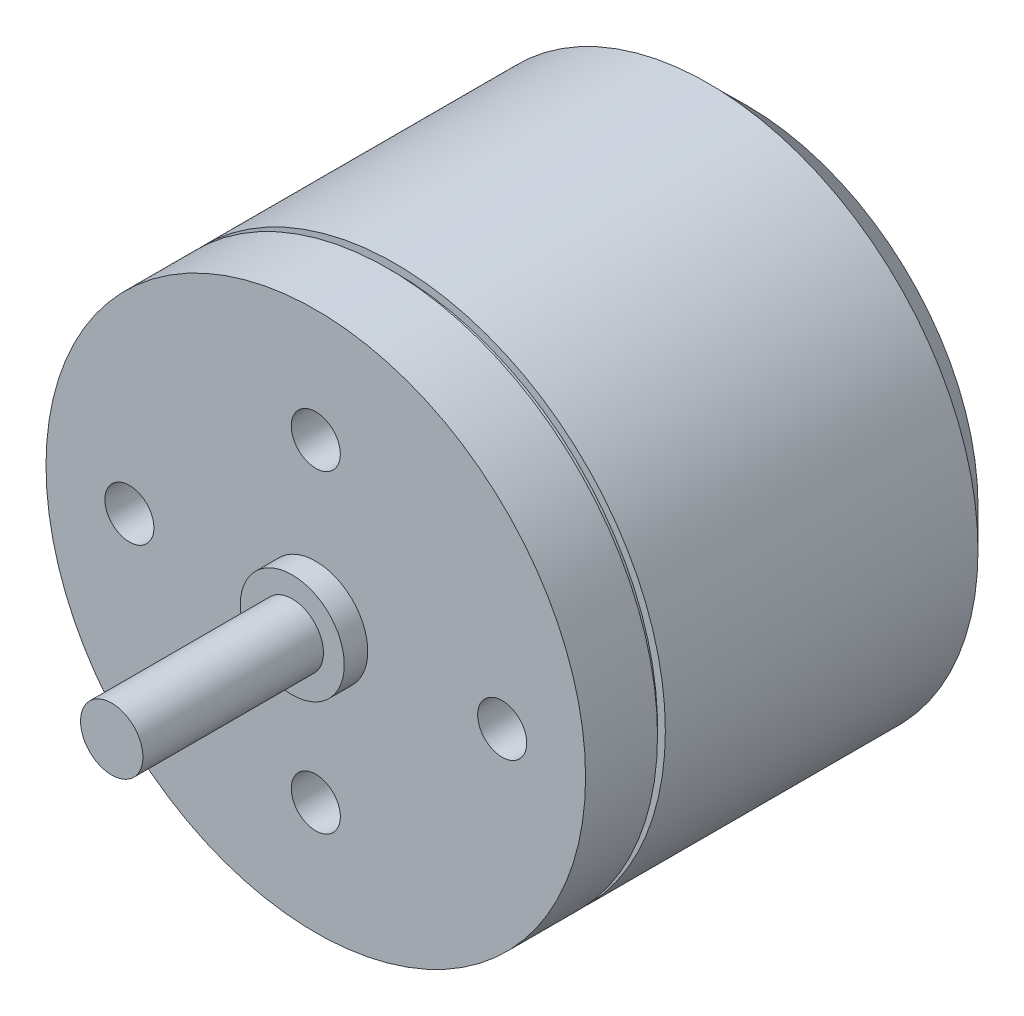
ISO-10303-21;
HEADER;
FILE_DESCRIPTION(('STEP AP214'),'2;1');
FILE_NAME('part.step','',(''),(''),'','','');
FILE_SCHEMA(('AUTOMOTIVE_DESIGN { 1 0 10303 214 1 1 1 1 }'));
ENDSEC;
DATA;
#1=APPLICATION_CONTEXT('core data for automotive mechanical design processes');
#2=APPLICATION_PROTOCOL_DEFINITION('international standard','automotive_design',2000,#1);
#3=PRODUCT_CONTEXT('',#1,'mechanical');
#4=PRODUCT('Part','Part','',(#3));
#5=PRODUCT_RELATED_PRODUCT_CATEGORY('part','',(#4));
#6=PRODUCT_DEFINITION_FORMATION('','',#4);
#7=PRODUCT_DEFINITION_CONTEXT('part definition',#1,'design');
#8=PRODUCT_DEFINITION('design','',#6,#7);
#9=PRODUCT_DEFINITION_SHAPE('','',#8);
#10=(LENGTH_UNIT() NAMED_UNIT(*) SI_UNIT(.MILLI.,.METRE.));
#11=(NAMED_UNIT(*) PLANE_ANGLE_UNIT() SI_UNIT($,.RADIAN.));
#12=(NAMED_UNIT(*) SI_UNIT($,.STERADIAN.) SOLID_ANGLE_UNIT());
#13=UNCERTAINTY_MEASURE_WITH_UNIT(LENGTH_MEASURE(1.E-05),#10,'distance_accuracy_value','');
#14=(GEOMETRIC_REPRESENTATION_CONTEXT(3) GLOBAL_UNCERTAINTY_ASSIGNED_CONTEXT((#13)) GLOBAL_UNIT_ASSIGNED_CONTEXT((#10,
#11,#12)) REPRESENTATION_CONTEXT('',''));
#15=CARTESIAN_POINT('',(0.,0.,0.));
#16=DIRECTION('',(0.,0.,1.));
#17=DIRECTION('',(1.,0.,0.));
#18=AXIS2_PLACEMENT_3D('',#15,#16,#17);
#19=CARTESIAN_POINT('',(0.,0.,1.2));
#20=DIRECTION('',(0.,0.,1.));
#21=DIRECTION('',(1.,0.,0.));
#22=AXIS2_PLACEMENT_3D('',#19,#20,#21);
#23=PLANE('',#22);
#24=CARTESIAN_POINT('',(0.,0.,1.2));
#25=DIRECTION('',(0.,0.,1.));
#26=DIRECTION('',(1.,0.,0.));
#27=AXIS2_PLACEMENT_3D('',#24,#25,#26);
#28=CIRCLE('',#27,2.65);
#29=CARTESIAN_POINT('',(2.65,0.,1.2));
#30=VERTEX_POINT('',#29);
#31=EDGE_CURVE('E112',#30,#30,#28,.T.);
#32=ORIENTED_EDGE('',*,*,#31,.T.);
#33=EDGE_LOOP('',(#32));
#34=FACE_BOUND('',#33,.T.);
#35=CARTESIAN_POINT('',(0.,0.,1.2));
#36=DIRECTION('',(0.,0.,1.));
#37=DIRECTION('',(1.,0.,0.));
#38=AXIS2_PLACEMENT_3D('',#35,#36,#37);
#39=CIRCLE('',#38,1.59);
#40=CARTESIAN_POINT('',(1.59,0.,1.2));
#41=VERTEX_POINT('',#40);
#42=EDGE_CURVE('E118',#41,#41,#39,.T.);
#43=ORIENTED_EDGE('',*,*,#42,.F.);
#44=EDGE_LOOP('',(#43));
#45=FACE_BOUND('',#44,.T.);
#46=ADVANCED_FACE('F34',(#34,#45),#23,.T.);
#47=CARTESIAN_POINT('',(0.,0.,0.));
#48=DIRECTION('',(0.,0.,-1.));
#49=DIRECTION('',(-1.,0.,0.));
#50=AXIS2_PLACEMENT_3D('',#47,#48,#49);
#51=PLANE('',#50);
#52=CARTESIAN_POINT('',(0.,0.,0.));
#53=DIRECTION('',(0.,0.,-1.));
#54=DIRECTION('',(-1.,0.,0.));
#55=AXIS2_PLACEMENT_3D('',#52,#53,#54);
#56=CIRCLE('',#55,13.75);
#57=CARTESIAN_POINT('',(-13.75,0.,0.));
#58=VERTEX_POINT('',#57);
#59=EDGE_CURVE('E49',#58,#58,#56,.T.);
#60=ORIENTED_EDGE('',*,*,#59,.F.);
#61=EDGE_LOOP('',(#60));
#62=FACE_BOUND('',#61,.T.);
#63=CARTESIAN_POINT('',(9.5,0.,0.));
#64=DIRECTION('',(0.,0.,1.));
#65=DIRECTION('',(1.,0.,0.));
#66=AXIS2_PLACEMENT_3D('',#63,#64,#65);
#67=CIRCLE('',#66,1.25);
#68=CARTESIAN_POINT('',(10.75,0.,0.));
#69=VERTEX_POINT('',#68);
#70=EDGE_CURVE('E67',#69,#69,#67,.T.);
#71=ORIENTED_EDGE('',*,*,#70,.F.);
#72=EDGE_LOOP('',(#71));
#73=FACE_BOUND('',#72,.T.);
#74=CARTESIAN_POINT('',(0.,8.,0.));
#75=DIRECTION('',(0.,0.,1.));
#76=DIRECTION('',(1.,0.,0.));
#77=AXIS2_PLACEMENT_3D('',#74,#75,#76);
#78=CIRCLE('',#77,1.25);
#79=CARTESIAN_POINT('',(1.25,8.,0.));
#80=VERTEX_POINT('',#79);
#81=EDGE_CURVE('E73',#80,#80,#78,.T.);
#82=ORIENTED_EDGE('',*,*,#81,.F.);
#83=EDGE_LOOP('',(#82));
#84=FACE_BOUND('',#83,.T.);
#85=CARTESIAN_POINT('',(0.,-8.,0.));
#86=DIRECTION('',(0.,0.,1.));
#87=DIRECTION('',(-1.,0.,0.));
#88=AXIS2_PLACEMENT_3D('',#85,#86,#87);
#89=CIRCLE('',#88,1.25);
#90=CARTESIAN_POINT('',(-1.25,-8.,0.));
#91=VERTEX_POINT('',#90);
#92=EDGE_CURVE('E79',#91,#91,#89,.T.);
#93=ORIENTED_EDGE('',*,*,#92,.F.);
#94=EDGE_LOOP('',(#93));
#95=FACE_BOUND('',#94,.T.);
#96=CARTESIAN_POINT('',(-9.5,0.,0.));
#97=DIRECTION('',(0.,0.,1.));
#98=DIRECTION('',(-1.,0.,0.));
#99=AXIS2_PLACEMENT_3D('',#96,#97,#98);
#100=CIRCLE('',#99,1.25);
#101=CARTESIAN_POINT('',(-10.75,0.,0.));
#102=VERTEX_POINT('',#101);
#103=EDGE_CURVE('E85',#102,#102,#100,.T.);
#104=ORIENTED_EDGE('',*,*,#103,.F.);
#105=EDGE_LOOP('',(#104));
#106=FACE_BOUND('',#105,.T.);
#107=CARTESIAN_POINT('',(0.,0.,0.));
#108=DIRECTION('',(0.,0.,-1.));
#109=DIRECTION('',(-1.,0.,0.));
#110=AXIS2_PLACEMENT_3D('',#107,#108,#109);
#111=CIRCLE('',#110,2.65);
#112=CARTESIAN_POINT('',(-2.65,0.,0.));
#113=VERTEX_POINT('',#112);
#114=EDGE_CURVE('E45',#113,#113,#111,.F.);
#115=ORIENTED_EDGE('',*,*,#114,.F.);
#116=EDGE_LOOP('',(#115));
#117=FACE_BOUND('',#116,.T.);
#118=ADVANCED_FACE('F134',(#62,#73,#84,#95,#106,#117),#51,.F.);
#119=CARTESIAN_POINT('',(0.,0.,-22.));
#120=DIRECTION('',(0.,0.,-1.));
#121=DIRECTION('',(-1.,0.,0.));
#122=AXIS2_PLACEMENT_3D('',#119,#120,#121);
#123=CYLINDRICAL_SURFACE('',#122,13.75);
#124=CARTESIAN_POINT('',(0.,0.,-3.66666666666667));
#125=DIRECTION('',(0.,0.,-1.));
#126=DIRECTION('',(-1.,0.,0.));
#127=AXIS2_PLACEMENT_3D('',#124,#125,#126);
#128=CIRCLE('',#127,13.75);
#129=CARTESIAN_POINT('',(-13.75,0.,-3.66666666666667));
#130=VERTEX_POINT('',#129);
#131=EDGE_CURVE('E54',#130,#130,#128,.T.);
#132=ORIENTED_EDGE('',*,*,#131,.F.);
#133=EDGE_LOOP('',(#132));
#134=FACE_BOUND('',#133,.T.);
#135=ORIENTED_EDGE('',*,*,#59,.T.);
#136=EDGE_LOOP('',(#135));
#137=FACE_BOUND('',#136,.T.);
#138=ADVANCED_FACE('F140',(#134,#137),#123,.T.);
#139=CARTESIAN_POINT('',(13.35,0.,-3.66666666666667));
#140=DIRECTION('',(0.,0.,1.));
#141=DIRECTION('',(1.,0.,0.));
#142=AXIS2_PLACEMENT_3D('',#139,#140,#141);
#143=PLANE('',#142);
#144=CARTESIAN_POINT('',(0.,0.,-3.66666666666667));
#145=DIRECTION('',(0.,0.,-1.));
#146=DIRECTION('',(-1.,0.,0.));
#147=AXIS2_PLACEMENT_3D('',#144,#145,#146);
#148=CIRCLE('',#147,13.35);
#149=CARTESIAN_POINT('',(-13.35,0.,-3.66666666666667));
#150=VERTEX_POINT('',#149);
#151=EDGE_CURVE('E57',#150,#150,#148,.T.);
#152=ORIENTED_EDGE('',*,*,#151,.F.);
#153=EDGE_LOOP('',(#152));
#154=FACE_BOUND('',#153,.T.);
#155=ORIENTED_EDGE('',*,*,#131,.T.);
#156=EDGE_LOOP('',(#155));
#157=FACE_BOUND('',#156,.T.);
#158=ADVANCED_FACE('F224',(#154,#157),#143,.F.);
#159=CARTESIAN_POINT('',(0.,0.,-22.));
#160=DIRECTION('',(0.,0.,-1.));
#161=DIRECTION('',(-1.,0.,0.));
#162=AXIS2_PLACEMENT_3D('',#159,#160,#161);
#163=CYLINDRICAL_SURFACE('',#162,13.35);
#164=CARTESIAN_POINT('',(0.,0.,-4.06666666666667));
#165=DIRECTION('',(0.,0.,-1.));
#166=DIRECTION('',(-1.,0.,0.));
#167=AXIS2_PLACEMENT_3D('',#164,#165,#166);
#168=CIRCLE('',#167,13.35);
#169=CARTESIAN_POINT('',(-13.35,0.,-4.06666666666667));
#170=VERTEX_POINT('',#169);
#171=EDGE_CURVE('E60',#170,#170,#168,.T.);
#172=ORIENTED_EDGE('',*,*,#171,.F.);
#173=EDGE_LOOP('',(#172));
#174=FACE_BOUND('',#173,.T.);
#175=ORIENTED_EDGE('',*,*,#151,.T.);
#176=EDGE_LOOP('',(#175));
#177=FACE_BOUND('',#176,.T.);
#178=ADVANCED_FACE('F220',(#174,#177),#163,.T.);
#179=CARTESIAN_POINT('',(13.75,0.,-4.06666666666667));
#180=DIRECTION('',(0.,0.,-1.));
#181=DIRECTION('',(-1.,0.,0.));
#182=AXIS2_PLACEMENT_3D('',#179,#180,#181);
#183=PLANE('',#182);
#184=CARTESIAN_POINT('',(0.,0.,-4.06666666666667));
#185=DIRECTION('',(0.,0.,-1.));
#186=DIRECTION('',(-1.,0.,0.));
#187=AXIS2_PLACEMENT_3D('',#184,#185,#186);
#188=CIRCLE('',#187,13.75);
#189=CARTESIAN_POINT('',(-13.75,0.,-4.06666666666667));
#190=VERTEX_POINT('',#189);
#191=EDGE_CURVE('E63',#190,#190,#188,.T.);
#192=ORIENTED_EDGE('',*,*,#191,.F.);
#193=EDGE_LOOP('',(#192));
#194=FACE_BOUND('',#193,.T.);
#195=ORIENTED_EDGE('',*,*,#171,.T.);
#196=EDGE_LOOP('',(#195));
#197=FACE_BOUND('',#196,.T.);
#198=ADVANCED_FACE('F217',(#194,#197),#183,.F.);
#199=CARTESIAN_POINT('',(0.,0.,-22.));
#200=DIRECTION('',(0.,0.,-1.));
#201=DIRECTION('',(-1.,0.,0.));
#202=AXIS2_PLACEMENT_3D('',#199,#200,#201);
#203=CYLINDRICAL_SURFACE('',#202,13.75);
#204=CARTESIAN_POINT('',(0.,0.,-20.));
#205=DIRECTION('',(0.,0.,1.));
#206=DIRECTION('',(1.,0.,0.));
#207=AXIS2_PLACEMENT_3D('',#204,#205,#206);
#208=CIRCLE('',#207,13.75);
#209=CARTESIAN_POINT('',(13.75,0.,-20.));
#210=VERTEX_POINT('',#209);
#211=EDGE_CURVE('E10',#210,#210,#208,.T.);
#212=ORIENTED_EDGE('',*,*,#211,.T.);
#213=EDGE_LOOP('',(#212));
#214=FACE_BOUND('',#213,.T.);
#215=ORIENTED_EDGE('',*,*,#191,.T.);
#216=EDGE_LOOP('',(#215));
#217=FACE_BOUND('',#216,.T.);
#218=ADVANCED_FACE('F214',(#214,#217),#203,.T.);
#219=CARTESIAN_POINT('',(13.75,0.,-22.));
#220=DIRECTION('',(0.,0.,1.));
#221=DIRECTION('',(1.,0.,0.));
#222=AXIS2_PLACEMENT_3D('',#219,#220,#221);
#223=PLANE('',#222);
#224=CARTESIAN_POINT('',(0.,0.,-22.));
#225=DIRECTION('',(0.,0.,1.));
#226=DIRECTION('',(1.,0.,0.));
#227=AXIS2_PLACEMENT_3D('',#224,#225,#226);
#228=CIRCLE('',#227,11.75);
#229=CARTESIAN_POINT('',(11.75,0.,-22.));
#230=VERTEX_POINT('',#229);
#231=EDGE_CURVE('E41',#230,#230,#228,.F.);
#232=ORIENTED_EDGE('',*,*,#231,.T.);
#233=EDGE_LOOP('',(#232));
#234=FACE_BOUND('',#233,.T.);
#235=CARTESIAN_POINT('',(0.,6.,-22.));
#236=DIRECTION('',(0.,0.,-1.));
#237=DIRECTION('',(-1.,0.,0.));
#238=AXIS2_PLACEMENT_3D('',#235,#236,#237);
#239=CIRCLE('',#238,1.25);
#240=CARTESIAN_POINT('',(-1.25,6.,-22.));
#241=VERTEX_POINT('',#240);
#242=EDGE_CURVE('E109',#241,#241,#239,.T.);
#243=ORIENTED_EDGE('',*,*,#242,.F.);
#244=EDGE_LOOP('',(#243));
#245=FACE_BOUND('',#244,.T.);
#246=CARTESIAN_POINT('',(6.,0.,-22.));
#247=DIRECTION('',(0.,0.,-1.));
#248=DIRECTION('',(-1.,0.,0.));
#249=AXIS2_PLACEMENT_3D('',#246,#247,#248);
#250=CIRCLE('',#249,1.25);
#251=CARTESIAN_POINT('',(4.75,0.,-22.));
#252=VERTEX_POINT('',#251);
#253=EDGE_CURVE('E103',#252,#252,#250,.T.);
#254=ORIENTED_EDGE('',*,*,#253,.F.);
#255=EDGE_LOOP('',(#254));
#256=FACE_BOUND('',#255,.T.);
#257=CARTESIAN_POINT('',(0.,-6.,-22.));
#258=DIRECTION('',(0.,0.,-1.));
#259=DIRECTION('',(-1.,0.,0.));
#260=AXIS2_PLACEMENT_3D('',#257,#258,#259);
#261=CIRCLE('',#260,1.25);
#262=CARTESIAN_POINT('',(-1.25,-6.,-22.));
#263=VERTEX_POINT('',#262);
#264=EDGE_CURVE('E97',#263,#263,#261,.T.);
#265=ORIENTED_EDGE('',*,*,#264,.F.);
#266=EDGE_LOOP('',(#265));
#267=FACE_BOUND('',#266,.T.);
#268=CARTESIAN_POINT('',(-6.,0.,-22.));
#269=DIRECTION('',(0.,0.,-1.));
#270=DIRECTION('',(-1.,0.,0.));
#271=AXIS2_PLACEMENT_3D('',#268,#269,#270);
#272=CIRCLE('',#271,1.25);
#273=CARTESIAN_POINT('',(-7.25,0.,-22.));
#274=VERTEX_POINT('',#273);
#275=EDGE_CURVE('E91',#274,#274,#272,.T.);
#276=ORIENTED_EDGE('',*,*,#275,.F.);
#277=EDGE_LOOP('',(#276));
#278=FACE_BOUND('',#277,.T.);
#279=ADVANCED_FACE('F210',(#234,#245,#256,#267,#278),#223,.F.);
#280=CARTESIAN_POINT('',(9.5,0.,-2.));
#281=DIRECTION('',(0.,0.,1.));
#282=DIRECTION('',(1.,0.,0.));
#283=AXIS2_PLACEMENT_3D('',#280,#281,#282);
#284=CYLINDRICAL_SURFACE('',#283,1.25);
#285=CARTESIAN_POINT('',(9.5,0.,-2.));
#286=DIRECTION('',(0.,0.,1.));
#287=DIRECTION('',(1.,0.,0.));
#288=AXIS2_PLACEMENT_3D('',#285,#286,#287);
#289=CIRCLE('',#288,1.25);
#290=CARTESIAN_POINT('',(10.75,0.,-2.));
#291=VERTEX_POINT('',#290);
#292=EDGE_CURVE('E66',#291,#291,#289,.T.);
#293=ORIENTED_EDGE('',*,*,#292,.F.);
#294=EDGE_LOOP('',(#293));
#295=FACE_BOUND('',#294,.T.);
#296=ORIENTED_EDGE('',*,*,#70,.T.);
#297=EDGE_LOOP('',(#296));
#298=FACE_BOUND('',#297,.T.);
#299=ADVANCED_FACE('F206',(#295,#298),#284,.F.);
#300=CARTESIAN_POINT('',(9.5,0.,-2.));
#301=DIRECTION('',(0.,0.,1.));
#302=DIRECTION('',(1.,0.,0.));
#303=AXIS2_PLACEMENT_3D('',#300,#301,#302);
#304=PLANE('',#303);
#305=ORIENTED_EDGE('',*,*,#292,.T.);
#306=EDGE_LOOP('',(#305));
#307=FACE_BOUND('',#306,.T.);
#308=ADVANCED_FACE('F202',(#307),#304,.T.);
#309=CARTESIAN_POINT('',(0.,8.,-2.));
#310=DIRECTION('',(0.,0.,1.));
#311=DIRECTION('',(1.,0.,0.));
#312=AXIS2_PLACEMENT_3D('',#309,#310,#311);
#313=CYLINDRICAL_SURFACE('',#312,1.25);
#314=CARTESIAN_POINT('',(0.,8.,-2.));
#315=DIRECTION('',(0.,0.,1.));
#316=DIRECTION('',(1.,0.,0.));
#317=AXIS2_PLACEMENT_3D('',#314,#315,#316);
#318=CIRCLE('',#317,1.25);
#319=CARTESIAN_POINT('',(1.25,8.,-2.));
#320=VERTEX_POINT('',#319);
#321=EDGE_CURVE('E70',#320,#320,#318,.T.);
#322=ORIENTED_EDGE('',*,*,#321,.F.);
#323=EDGE_LOOP('',(#322));
#324=FACE_BOUND('',#323,.T.);
#325=ORIENTED_EDGE('',*,*,#81,.T.);
#326=EDGE_LOOP('',(#325));
#327=FACE_BOUND('',#326,.T.);
#328=ADVANCED_FACE('F198',(#324,#327),#313,.F.);
#329=CARTESIAN_POINT('',(0.,8.,-2.));
#330=DIRECTION('',(0.,0.,1.));
#331=DIRECTION('',(1.,0.,0.));
#332=AXIS2_PLACEMENT_3D('',#329,#330,#331);
#333=PLANE('',#332);
#334=ORIENTED_EDGE('',*,*,#321,.T.);
#335=EDGE_LOOP('',(#334));
#336=FACE_BOUND('',#335,.T.);
#337=ADVANCED_FACE('F194',(#336),#333,.T.);
#338=CARTESIAN_POINT('',(0.,-8.,-2.));
#339=DIRECTION('',(0.,0.,1.));
#340=DIRECTION('',(1.,0.,0.));
#341=AXIS2_PLACEMENT_3D('',#338,#339,#340);
#342=CYLINDRICAL_SURFACE('',#341,1.25);
#343=CARTESIAN_POINT('',(0.,-8.,-2.));
#344=DIRECTION('',(0.,0.,1.));
#345=DIRECTION('',(-1.,0.,0.));
#346=AXIS2_PLACEMENT_3D('',#343,#344,#345);
#347=CIRCLE('',#346,1.25);
#348=CARTESIAN_POINT('',(-1.25,-8.,-2.));
#349=VERTEX_POINT('',#348);
#350=EDGE_CURVE('E76',#349,#349,#347,.T.);
#351=ORIENTED_EDGE('',*,*,#350,.F.);
#352=EDGE_LOOP('',(#351));
#353=FACE_BOUND('',#352,.T.);
#354=ORIENTED_EDGE('',*,*,#92,.T.);
#355=EDGE_LOOP('',(#354));
#356=FACE_BOUND('',#355,.T.);
#357=ADVANCED_FACE('F190',(#353,#356),#342,.F.);
#358=CARTESIAN_POINT('',(0.,-8.,-2.));
#359=DIRECTION('',(0.,0.,-1.));
#360=DIRECTION('',(-1.,0.,0.));
#361=AXIS2_PLACEMENT_3D('',#358,#359,#360);
#362=PLANE('',#361);
#363=ORIENTED_EDGE('',*,*,#350,.T.);
#364=EDGE_LOOP('',(#363));
#365=FACE_BOUND('',#364,.T.);
#366=ADVANCED_FACE('F186',(#365),#362,.F.);
#367=CARTESIAN_POINT('',(-9.5,0.,-2.));
#368=DIRECTION('',(0.,0.,1.));
#369=DIRECTION('',(1.,0.,0.));
#370=AXIS2_PLACEMENT_3D('',#367,#368,#369);
#371=CYLINDRICAL_SURFACE('',#370,1.25);
#372=CARTESIAN_POINT('',(-9.5,0.,-2.));
#373=DIRECTION('',(0.,0.,1.));
#374=DIRECTION('',(-1.,0.,0.));
#375=AXIS2_PLACEMENT_3D('',#372,#373,#374);
#376=CIRCLE('',#375,1.25);
#377=CARTESIAN_POINT('',(-10.75,0.,-2.));
#378=VERTEX_POINT('',#377);
#379=EDGE_CURVE('E82',#378,#378,#376,.T.);
#380=ORIENTED_EDGE('',*,*,#379,.F.);
#381=EDGE_LOOP('',(#380));
#382=FACE_BOUND('',#381,.T.);
#383=ORIENTED_EDGE('',*,*,#103,.T.);
#384=EDGE_LOOP('',(#383));
#385=FACE_BOUND('',#384,.T.);
#386=ADVANCED_FACE('F182',(#382,#385),#371,.F.);
#387=CARTESIAN_POINT('',(-9.5,0.,-2.));
#388=DIRECTION('',(0.,0.,-1.));
#389=DIRECTION('',(-1.,0.,0.));
#390=AXIS2_PLACEMENT_3D('',#387,#388,#389);
#391=PLANE('',#390);
#392=ORIENTED_EDGE('',*,*,#379,.T.);
#393=EDGE_LOOP('',(#392));
#394=FACE_BOUND('',#393,.T.);
#395=ADVANCED_FACE('F178',(#394),#391,.F.);
#396=CARTESIAN_POINT('',(-6.,0.,-20.));
#397=DIRECTION('',(0.,0.,-1.));
#398=DIRECTION('',(-1.,0.,0.));
#399=AXIS2_PLACEMENT_3D('',#396,#397,#398);
#400=CYLINDRICAL_SURFACE('',#399,1.25);
#401=CARTESIAN_POINT('',(-6.,0.,-20.));
#402=DIRECTION('',(0.,0.,-1.));
#403=DIRECTION('',(-1.,0.,0.));
#404=AXIS2_PLACEMENT_3D('',#401,#402,#403);
#405=CIRCLE('',#404,1.25);
#406=CARTESIAN_POINT('',(-7.25,0.,-20.));
#407=VERTEX_POINT('',#406);
#408=EDGE_CURVE('E88',#407,#407,#405,.T.);
#409=ORIENTED_EDGE('',*,*,#408,.F.);
#410=EDGE_LOOP('',(#409));
#411=FACE_BOUND('',#410,.T.);
#412=ORIENTED_EDGE('',*,*,#275,.T.);
#413=EDGE_LOOP('',(#412));
#414=FACE_BOUND('',#413,.T.);
#415=ADVANCED_FACE('F174',(#411,#414),#400,.F.);
#416=CARTESIAN_POINT('',(-6.,0.,-20.));
#417=DIRECTION('',(0.,0.,-1.));
#418=DIRECTION('',(-1.,0.,0.));
#419=AXIS2_PLACEMENT_3D('',#416,#417,#418);
#420=PLANE('',#419);
#421=ORIENTED_EDGE('',*,*,#408,.T.);
#422=EDGE_LOOP('',(#421));
#423=FACE_BOUND('',#422,.T.);
#424=ADVANCED_FACE('F170',(#423),#420,.T.);
#425=CARTESIAN_POINT('',(0.,-6.,-20.));
#426=DIRECTION('',(0.,0.,-1.));
#427=DIRECTION('',(-1.,0.,0.));
#428=AXIS2_PLACEMENT_3D('',#425,#426,#427);
#429=CYLINDRICAL_SURFACE('',#428,1.25);
#430=CARTESIAN_POINT('',(0.,-6.,-20.));
#431=DIRECTION('',(0.,0.,-1.));
#432=DIRECTION('',(-1.,0.,0.));
#433=AXIS2_PLACEMENT_3D('',#430,#431,#432);
#434=CIRCLE('',#433,1.25);
#435=CARTESIAN_POINT('',(-1.25,-6.,-20.));
#436=VERTEX_POINT('',#435);
#437=EDGE_CURVE('E94',#436,#436,#434,.T.);
#438=ORIENTED_EDGE('',*,*,#437,.F.);
#439=EDGE_LOOP('',(#438));
#440=FACE_BOUND('',#439,.T.);
#441=ORIENTED_EDGE('',*,*,#264,.T.);
#442=EDGE_LOOP('',(#441));
#443=FACE_BOUND('',#442,.T.);
#444=ADVANCED_FACE('F166',(#440,#443),#429,.F.);
#445=CARTESIAN_POINT('',(0.,-6.,-20.));
#446=DIRECTION('',(0.,0.,-1.));
#447=DIRECTION('',(-1.,0.,0.));
#448=AXIS2_PLACEMENT_3D('',#445,#446,#447);
#449=PLANE('',#448);
#450=ORIENTED_EDGE('',*,*,#437,.T.);
#451=EDGE_LOOP('',(#450));
#452=FACE_BOUND('',#451,.T.);
#453=ADVANCED_FACE('F162',(#452),#449,.T.);
#454=CARTESIAN_POINT('',(6.,0.,-20.));
#455=DIRECTION('',(0.,0.,-1.));
#456=DIRECTION('',(-1.,0.,0.));
#457=AXIS2_PLACEMENT_3D('',#454,#455,#456);
#458=CYLINDRICAL_SURFACE('',#457,1.25);
#459=CARTESIAN_POINT('',(6.,0.,-20.));
#460=DIRECTION('',(0.,0.,-1.));
#461=DIRECTION('',(-1.,0.,0.));
#462=AXIS2_PLACEMENT_3D('',#459,#460,#461);
#463=CIRCLE('',#462,1.25);
#464=CARTESIAN_POINT('',(4.75,0.,-20.));
#465=VERTEX_POINT('',#464);
#466=EDGE_CURVE('E100',#465,#465,#463,.T.);
#467=ORIENTED_EDGE('',*,*,#466,.F.);
#468=EDGE_LOOP('',(#467));
#469=FACE_BOUND('',#468,.T.);
#470=ORIENTED_EDGE('',*,*,#253,.T.);
#471=EDGE_LOOP('',(#470));
#472=FACE_BOUND('',#471,.T.);
#473=ADVANCED_FACE('F158',(#469,#472),#458,.F.);
#474=CARTESIAN_POINT('',(6.,0.,-20.));
#475=DIRECTION('',(0.,0.,-1.));
#476=DIRECTION('',(-1.,0.,0.));
#477=AXIS2_PLACEMENT_3D('',#474,#475,#476);
#478=PLANE('',#477);
#479=ORIENTED_EDGE('',*,*,#466,.T.);
#480=EDGE_LOOP('',(#479));
#481=FACE_BOUND('',#480,.T.);
#482=ADVANCED_FACE('F154',(#481),#478,.T.);
#483=CARTESIAN_POINT('',(0.,6.,-20.));
#484=DIRECTION('',(0.,0.,-1.));
#485=DIRECTION('',(-1.,0.,0.));
#486=AXIS2_PLACEMENT_3D('',#483,#484,#485);
#487=CYLINDRICAL_SURFACE('',#486,1.25);
#488=CARTESIAN_POINT('',(0.,6.,-20.));
#489=DIRECTION('',(0.,0.,-1.));
#490=DIRECTION('',(-1.,0.,0.));
#491=AXIS2_PLACEMENT_3D('',#488,#489,#490);
#492=CIRCLE('',#491,1.25);
#493=CARTESIAN_POINT('',(-1.25,6.,-20.));
#494=VERTEX_POINT('',#493);
#495=EDGE_CURVE('E106',#494,#494,#492,.T.);
#496=ORIENTED_EDGE('',*,*,#495,.F.);
#497=EDGE_LOOP('',(#496));
#498=FACE_BOUND('',#497,.T.);
#499=ORIENTED_EDGE('',*,*,#242,.T.);
#500=EDGE_LOOP('',(#499));
#501=FACE_BOUND('',#500,.T.);
#502=ADVANCED_FACE('F150',(#498,#501),#487,.F.);
#503=CARTESIAN_POINT('',(0.,6.,-20.));
#504=DIRECTION('',(0.,0.,-1.));
#505=DIRECTION('',(-1.,0.,0.));
#506=AXIS2_PLACEMENT_3D('',#503,#504,#505);
#507=PLANE('',#506);
#508=ORIENTED_EDGE('',*,*,#495,.T.);
#509=EDGE_LOOP('',(#508));
#510=FACE_BOUND('',#509,.T.);
#511=ADVANCED_FACE('F146',(#510),#507,.T.);
#512=CARTESIAN_POINT('',(0.,0.,1.2));
#513=DIRECTION('',(0.,0.,-1.));
#514=DIRECTION('',(-1.,0.,0.));
#515=AXIS2_PLACEMENT_3D('',#512,#513,#514);
#516=CYLINDRICAL_SURFACE('',#515,2.65);
#517=ORIENTED_EDGE('',*,*,#31,.F.);
#518=EDGE_LOOP('',(#517));
#519=FACE_BOUND('',#518,.T.);
#520=ORIENTED_EDGE('',*,*,#114,.T.);
#521=EDGE_LOOP('',(#520));
#522=FACE_BOUND('',#521,.T.);
#523=ADVANCED_FACE('F129',(#519,#522),#516,.T.);
#524=CARTESIAN_POINT('',(0.,0.,10.4));
#525=DIRECTION('',(0.,0.,-1.));
#526=DIRECTION('',(-1.,0.,0.));
#527=AXIS2_PLACEMENT_3D('',#524,#525,#526);
#528=CYLINDRICAL_SURFACE('',#527,1.59);
#529=CARTESIAN_POINT('',(0.,0.,10.4));
#530=DIRECTION('',(0.,0.,1.));
#531=DIRECTION('',(1.,0.,0.));
#532=AXIS2_PLACEMENT_3D('',#529,#530,#531);
#533=CIRCLE('',#532,1.59);
#534=CARTESIAN_POINT('',(1.59,0.,10.4));
#535=VERTEX_POINT('',#534);
#536=EDGE_CURVE('E117',#535,#535,#533,.T.);
#537=ORIENTED_EDGE('',*,*,#536,.F.);
#538=EDGE_LOOP('',(#537));
#539=FACE_BOUND('',#538,.T.);
#540=ORIENTED_EDGE('',*,*,#42,.T.);
#541=EDGE_LOOP('',(#540));
#542=FACE_BOUND('',#541,.T.);
#543=ADVANCED_FACE('F126',(#539,#542),#528,.T.);
#544=CARTESIAN_POINT('',(0.,0.,10.4));
#545=DIRECTION('',(0.,0.,1.));
#546=DIRECTION('',(1.,0.,0.));
#547=AXIS2_PLACEMENT_3D('',#544,#545,#546);
#548=PLANE('',#547);
#549=ORIENTED_EDGE('',*,*,#536,.T.);
#550=EDGE_LOOP('',(#549));
#551=FACE_BOUND('',#550,.T.);
#552=ADVANCED_FACE('F124',(#551),#548,.T.);
#553=CARTESIAN_POINT('',(0.,0.,-22.));
#554=DIRECTION('',(0.,0.,1.));
#555=DIRECTION('',(1.,0.,0.));
#556=AXIS2_PLACEMENT_3D('',#553,#554,#555);
#557=CONICAL_SURFACE('',#556,11.75,0.785398163397444);
#558=ORIENTED_EDGE('',*,*,#211,.F.);
#559=EDGE_LOOP('',(#558));
#560=FACE_BOUND('',#559,.T.);
#561=ORIENTED_EDGE('',*,*,#231,.F.);
#562=EDGE_LOOP('',(#561));
#563=FACE_BOUND('',#562,.T.);
#564=ADVANCED_FACE('F36',(#560,#563),#557,.T.);
#565=CLOSED_SHELL('',(#46,#118,#138,#158,#178,#198,#218,#279,#299,#308,#328,#337,#357,#366,#386,
#395,#415,#424,#444,#453,#473,#482,#502,#511,#523,#543,#552,#564));
#566=MANIFOLD_SOLID_BREP('B2',#565);
#567=ADVANCED_BREP_SHAPE_REPRESENTATION('',(#18,#566),#14);
#568=SHAPE_DEFINITION_REPRESENTATION(#9,#567);
ENDSEC;
END-ISO-10303-21;
